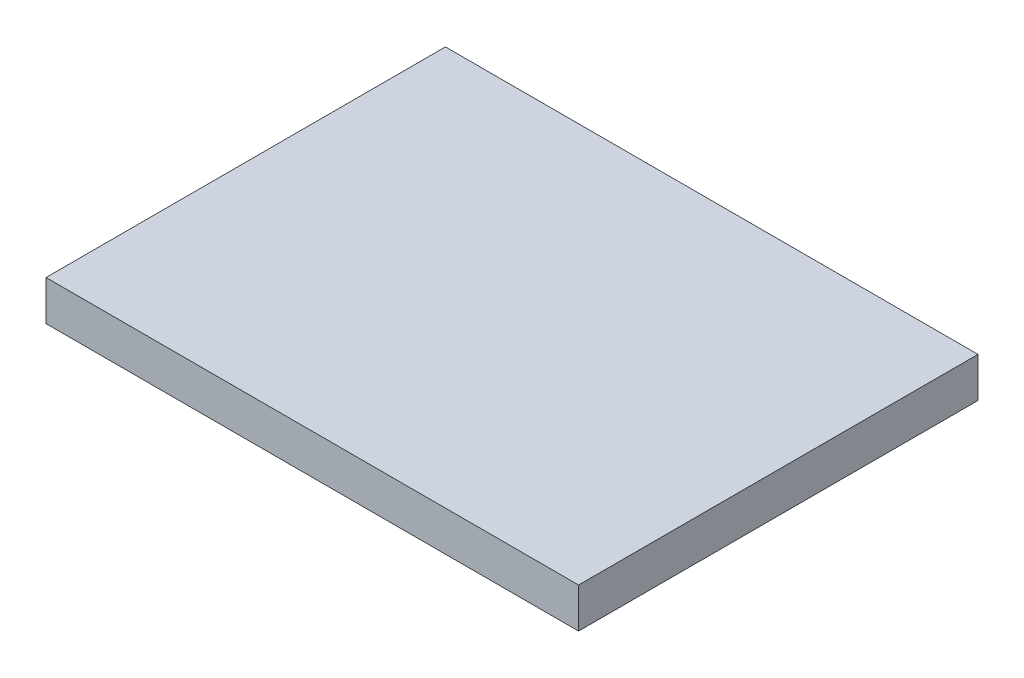
ISO-10303-21;
HEADER;
FILE_DESCRIPTION(('STEP AP214'),'2;1');
FILE_NAME('part.step','',(''),(''),'','','');
FILE_SCHEMA(('AUTOMOTIVE_DESIGN { 1 0 10303 214 1 1 1 1 }'));
ENDSEC;
DATA;
#1=APPLICATION_CONTEXT('core data for automotive mechanical design processes');
#2=APPLICATION_PROTOCOL_DEFINITION('international standard','automotive_design',2000,#1);
#3=PRODUCT_CONTEXT('',#1,'mechanical');
#4=PRODUCT('Part','Part','',(#3));
#5=PRODUCT_RELATED_PRODUCT_CATEGORY('part','',(#4));
#6=PRODUCT_DEFINITION_FORMATION('','',#4);
#7=PRODUCT_DEFINITION_CONTEXT('part definition',#1,'design');
#8=PRODUCT_DEFINITION('design','',#6,#7);
#9=PRODUCT_DEFINITION_SHAPE('','',#8);
#10=(LENGTH_UNIT() NAMED_UNIT(*) SI_UNIT(.MILLI.,.METRE.));
#11=(NAMED_UNIT(*) PLANE_ANGLE_UNIT() SI_UNIT($,.RADIAN.));
#12=(NAMED_UNIT(*) SI_UNIT($,.STERADIAN.) SOLID_ANGLE_UNIT());
#13=UNCERTAINTY_MEASURE_WITH_UNIT(LENGTH_MEASURE(1.E-05),#10,'distance_accuracy_value','');
#14=(GEOMETRIC_REPRESENTATION_CONTEXT(3) GLOBAL_UNCERTAINTY_ASSIGNED_CONTEXT((#13)) GLOBAL_UNIT_ASSIGNED_CONTEXT((#10,
#11,#12)) REPRESENTATION_CONTEXT('',''));
#15=CARTESIAN_POINT('',(0.,0.,0.));
#16=DIRECTION('',(0.,0.,1.));
#17=DIRECTION('',(1.,0.,0.));
#18=AXIS2_PLACEMENT_3D('',#15,#16,#17);
#19=CARTESIAN_POINT('',(-128.788024561175,533.994449049259,150.));
#20=DIRECTION('',(1.,0.,0.));
#21=DIRECTION('',(0.,0.,-1.));
#22=AXIS2_PLACEMENT_3D('',#19,#20,#21);
#23=PLANE('',#22);
#24=DIRECTION('',(0.,-1.,0.));
#25=VECTOR('',#24,1.);
#26=CARTESIAN_POINT('',(-128.788024561175,533.994449049259,-150.));
#27=LINE('',#26,#25);
#28=CARTESIAN_POINT('',(-128.788024561175,533.994449049259,-150.));
#29=VERTEX_POINT('',#28);
#30=CARTESIAN_POINT('',(-128.788024561175,503.994449049259,-150.));
#31=VERTEX_POINT('',#30);
#32=EDGE_CURVE('E96',#29,#31,#27,.T.);
#33=ORIENTED_EDGE('',*,*,#32,.T.);
#34=DIRECTION('',(0.,0.,-1.));
#35=VECTOR('',#34,1.);
#36=CARTESIAN_POINT('',(-128.788024561175,503.994449049259,150.));
#37=LINE('',#36,#35);
#38=CARTESIAN_POINT('',(-128.788024561175,503.994449049259,150.));
#39=VERTEX_POINT('',#38);
#40=EDGE_CURVE('E11',#39,#31,#37,.T.);
#41=ORIENTED_EDGE('',*,*,#40,.F.);
#42=DIRECTION('',(0.,-1.,0.));
#43=VECTOR('',#42,1.);
#44=CARTESIAN_POINT('',(-128.788024561175,533.994449049259,150.));
#45=LINE('',#44,#43);
#46=CARTESIAN_POINT('',(-128.788024561175,533.994449049259,150.));
#47=VERTEX_POINT('',#46);
#48=EDGE_CURVE('E84',#47,#39,#45,.T.);
#49=ORIENTED_EDGE('',*,*,#48,.F.);
#50=DIRECTION('',(0.,0.,-1.));
#51=VECTOR('',#50,1.);
#52=CARTESIAN_POINT('',(-128.788024561175,533.994449049259,150.));
#53=LINE('',#52,#51);
#54=EDGE_CURVE('E92',#47,#29,#53,.T.);
#55=ORIENTED_EDGE('',*,*,#54,.T.);
#56=EDGE_LOOP('',(#33,#41,#49,#55));
#57=FACE_BOUND('',#56,.T.);
#58=ADVANCED_FACE('F33',(#57),#23,.F.);
#59=CARTESIAN_POINT('',(-128.788024561175,503.994449049259,150.));
#60=DIRECTION('',(0.,1.,0.));
#61=DIRECTION('',(0.,0.,1.));
#62=AXIS2_PLACEMENT_3D('',#59,#60,#61);
#63=PLANE('',#62);
#64=DIRECTION('',(1.,0.,0.));
#65=VECTOR('',#64,1.);
#66=CARTESIAN_POINT('',(-128.788024561175,503.994449049259,-150.));
#67=LINE('',#66,#65);
#68=CARTESIAN_POINT('',(271.211975438825,503.994449049259,-150.));
#69=VERTEX_POINT('',#68);
#70=EDGE_CURVE('E88',#31,#69,#67,.T.);
#71=ORIENTED_EDGE('',*,*,#70,.T.);
#72=DIRECTION('',(0.,0.,-1.));
#73=VECTOR('',#72,1.);
#74=CARTESIAN_POINT('',(271.211975438825,503.994449049259,150.));
#75=LINE('',#74,#73);
#76=CARTESIAN_POINT('',(271.211975438825,503.994449049259,150.));
#77=VERTEX_POINT('',#76);
#78=EDGE_CURVE('E41',#77,#69,#75,.T.);
#79=ORIENTED_EDGE('',*,*,#78,.F.);
#80=DIRECTION('',(1.,0.,0.));
#81=VECTOR('',#80,1.);
#82=CARTESIAN_POINT('',(-128.788024561175,503.994449049259,150.));
#83=LINE('',#82,#81);
#84=EDGE_CURVE('E79',#39,#77,#83,.T.);
#85=ORIENTED_EDGE('',*,*,#84,.F.);
#86=ORIENTED_EDGE('',*,*,#40,.T.);
#87=EDGE_LOOP('',(#71,#79,#85,#86));
#88=FACE_BOUND('',#87,.T.);
#89=ADVANCED_FACE('F87',(#88),#63,.F.);
#90=CARTESIAN_POINT('',(271.211975438825,533.994449049259,150.));
#91=DIRECTION('',(-1.,0.,0.));
#92=DIRECTION('',(0.,0.,1.));
#93=AXIS2_PLACEMENT_3D('',#90,#91,#92);
#94=PLANE('',#93);
#95=DIRECTION('',(0.,1.,0.));
#96=VECTOR('',#95,1.);
#97=CARTESIAN_POINT('',(271.211975438825,533.994449049259,-150.));
#98=LINE('',#97,#96);
#99=CARTESIAN_POINT('',(271.211975438825,533.994449049259,-150.));
#100=VERTEX_POINT('',#99);
#101=EDGE_CURVE('E66',#69,#100,#98,.T.);
#102=ORIENTED_EDGE('',*,*,#101,.T.);
#103=DIRECTION('',(0.,0.,-1.));
#104=VECTOR('',#103,1.);
#105=CARTESIAN_POINT('',(271.211975438825,533.994449049259,150.));
#106=LINE('',#105,#104);
#107=CARTESIAN_POINT('',(271.211975438825,533.994449049259,150.));
#108=VERTEX_POINT('',#107);
#109=EDGE_CURVE('E89',#108,#100,#106,.T.);
#110=ORIENTED_EDGE('',*,*,#109,.F.);
#111=DIRECTION('',(0.,1.,0.));
#112=VECTOR('',#111,1.);
#113=CARTESIAN_POINT('',(271.211975438825,533.994449049259,150.));
#114=LINE('',#113,#112);
#115=EDGE_CURVE('E82',#77,#108,#114,.T.);
#116=ORIENTED_EDGE('',*,*,#115,.F.);
#117=ORIENTED_EDGE('',*,*,#78,.T.);
#118=EDGE_LOOP('',(#102,#110,#116,#117));
#119=FACE_BOUND('',#118,.T.);
#120=ADVANCED_FACE('F90',(#119),#94,.F.);
#121=CARTESIAN_POINT('',(-128.788024561175,533.994449049259,150.));
#122=DIRECTION('',(0.,-1.,0.));
#123=DIRECTION('',(0.,0.,-1.));
#124=AXIS2_PLACEMENT_3D('',#121,#122,#123);
#125=PLANE('',#124);
#126=DIRECTION('',(-1.,0.,0.));
#127=VECTOR('',#126,1.);
#128=CARTESIAN_POINT('',(-128.788024561175,533.994449049259,-150.));
#129=LINE('',#128,#127);
#130=EDGE_CURVE('E72',#100,#29,#129,.T.);
#131=ORIENTED_EDGE('',*,*,#130,.T.);
#132=ORIENTED_EDGE('',*,*,#54,.F.);
#133=DIRECTION('',(-1.,0.,0.));
#134=VECTOR('',#133,1.);
#135=CARTESIAN_POINT('',(-128.788024561175,533.994449049259,150.));
#136=LINE('',#135,#134);
#137=EDGE_CURVE('E49',#108,#47,#136,.T.);
#138=ORIENTED_EDGE('',*,*,#137,.F.);
#139=ORIENTED_EDGE('',*,*,#109,.T.);
#140=EDGE_LOOP('',(#131,#132,#138,#139));
#141=FACE_BOUND('',#140,.T.);
#142=ADVANCED_FACE('F103',(#141),#125,.F.);
#143=CARTESIAN_POINT('',(0.,0.,150.));
#144=DIRECTION('',(0.,0.,1.));
#145=DIRECTION('',(1.,0.,0.));
#146=AXIS2_PLACEMENT_3D('',#143,#144,#145);
#147=PLANE('',#146);
#148=ORIENTED_EDGE('',*,*,#48,.T.);
#149=ORIENTED_EDGE('',*,*,#84,.T.);
#150=ORIENTED_EDGE('',*,*,#115,.T.);
#151=ORIENTED_EDGE('',*,*,#137,.T.);
#152=EDGE_LOOP('',(#148,#149,#150,#151));
#153=FACE_BOUND('',#152,.T.);
#154=ADVANCED_FACE('F80',(#153),#147,.T.);
#155=CARTESIAN_POINT('',(0.,0.,-150.));
#156=DIRECTION('',(0.,0.,1.));
#157=DIRECTION('',(1.,0.,0.));
#158=AXIS2_PLACEMENT_3D('',#155,#156,#157);
#159=PLANE('',#158);
#160=ORIENTED_EDGE('',*,*,#32,.F.);
#161=ORIENTED_EDGE('',*,*,#130,.F.);
#162=ORIENTED_EDGE('',*,*,#101,.F.);
#163=ORIENTED_EDGE('',*,*,#70,.F.);
#164=EDGE_LOOP('',(#160,#161,#162,#163));
#165=FACE_BOUND('',#164,.T.);
#166=ADVANCED_FACE('F106',(#165),#159,.F.);
#167=CLOSED_SHELL('',(#58,#89,#120,#142,#154,#166));
#168=MANIFOLD_SOLID_BREP('B2',#167);
#169=ADVANCED_BREP_SHAPE_REPRESENTATION('',(#18,#168),#14);
#170=SHAPE_DEFINITION_REPRESENTATION(#9,#169);
ENDSEC;
END-ISO-10303-21;
